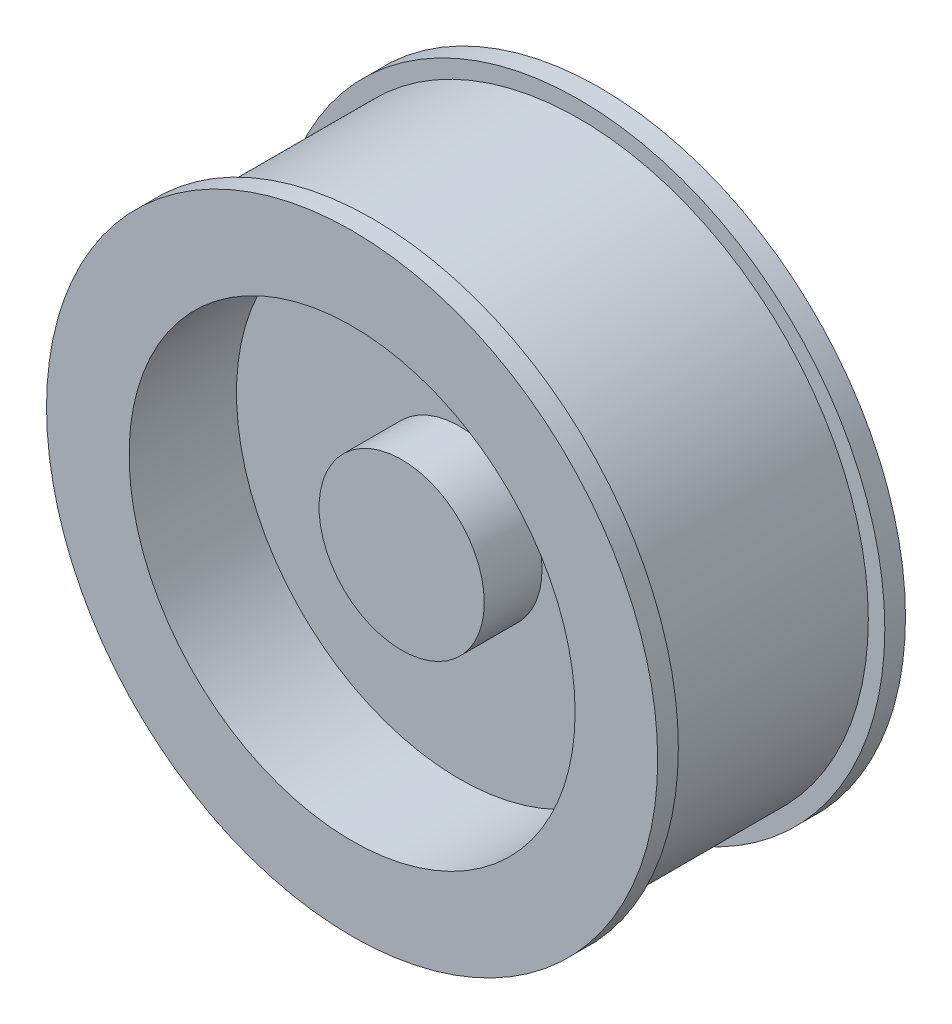
ISO-10303-21;
HEADER;
FILE_DESCRIPTION(('STEP AP214'),'2;1');
FILE_NAME('part.step','',(''),(''),'','','');
FILE_SCHEMA(('AUTOMOTIVE_DESIGN { 1 0 10303 214 1 1 1 1 }'));
ENDSEC;
DATA;
#1=APPLICATION_CONTEXT('core data for automotive mechanical design processes');
#2=APPLICATION_PROTOCOL_DEFINITION('international standard','automotive_design',2000,#1);
#3=PRODUCT_CONTEXT('',#1,'mechanical');
#4=PRODUCT('Part','Part','',(#3));
#5=PRODUCT_RELATED_PRODUCT_CATEGORY('part','',(#4));
#6=PRODUCT_DEFINITION_FORMATION('','',#4);
#7=PRODUCT_DEFINITION_CONTEXT('part definition',#1,'design');
#8=PRODUCT_DEFINITION('design','',#6,#7);
#9=PRODUCT_DEFINITION_SHAPE('','',#8);
#10=(LENGTH_UNIT() NAMED_UNIT(*) SI_UNIT(.MILLI.,.METRE.));
#11=(NAMED_UNIT(*) PLANE_ANGLE_UNIT() SI_UNIT($,.RADIAN.));
#12=(NAMED_UNIT(*) SI_UNIT($,.STERADIAN.) SOLID_ANGLE_UNIT());
#13=UNCERTAINTY_MEASURE_WITH_UNIT(LENGTH_MEASURE(1.E-05),#10,'distance_accuracy_value','');
#14=(GEOMETRIC_REPRESENTATION_CONTEXT(3) GLOBAL_UNCERTAINTY_ASSIGNED_CONTEXT((#13)) GLOBAL_UNIT_ASSIGNED_CONTEXT((#10,
#11,#12)) REPRESENTATION_CONTEXT('',''));
#15=CARTESIAN_POINT('',(0.,0.,0.));
#16=DIRECTION('',(0.,0.,1.));
#17=DIRECTION('',(1.,0.,0.));
#18=AXIS2_PLACEMENT_3D('',#15,#16,#17);
#19=CARTESIAN_POINT('',(0.,0.,30.));
#20=DIRECTION('',(0.,0.,-1.));
#21=DIRECTION('',(-1.,0.,0.));
#22=AXIS2_PLACEMENT_3D('',#19,#20,#21);
#23=PLANE('',#22);
#24=CARTESIAN_POINT('',(0.,-16.,30.));
#25=DIRECTION('',(0.,0.,1.));
#26=DIRECTION('',(1.,0.,0.));
#27=AXIS2_PLACEMENT_3D('',#24,#25,#26);
#28=CIRCLE('',#27,54.);
#29=CARTESIAN_POINT('',(54.,-16.,30.));
#30=VERTEX_POINT('',#29);
#31=EDGE_CURVE('E83',#30,#30,#28,.T.);
#32=ORIENTED_EDGE('',*,*,#31,.F.);
#33=EDGE_LOOP('',(#32));
#34=FACE_BOUND('',#33,.T.);
#35=CARTESIAN_POINT('',(0.,-16.,30.));
#36=DIRECTION('',(0.,0.,1.));
#37=DIRECTION('',(1.,0.,0.));
#38=AXIS2_PLACEMENT_3D('',#35,#36,#37);
#39=CIRCLE('',#38,74.);
#40=CARTESIAN_POINT('',(74.,-16.,30.));
#41=VERTEX_POINT('',#40);
#42=EDGE_CURVE('E10',#41,#41,#39,.T.);
#43=ORIENTED_EDGE('',*,*,#42,.T.);
#44=EDGE_LOOP('',(#43));
#45=FACE_BOUND('',#44,.T.);
#46=ADVANCED_FACE('F37',(#34,#45),#23,.F.);
#47=CARTESIAN_POINT('',(0.,-16.,-14.6133091179405));
#48=DIRECTION('',(0.,0.,1.));
#49=DIRECTION('',(1.,0.,0.));
#50=AXIS2_PLACEMENT_3D('',#47,#48,#49);
#51=CYLINDRICAL_SURFACE('',#50,74.);
#52=CARTESIAN_POINT('',(0.,-16.,25.));
#53=DIRECTION('',(0.,0.,1.));
#54=DIRECTION('',(1.,0.,0.));
#55=AXIS2_PLACEMENT_3D('',#52,#53,#54);
#56=CIRCLE('',#55,74.);
#57=CARTESIAN_POINT('',(74.,-16.,25.));
#58=VERTEX_POINT('',#57);
#59=EDGE_CURVE('E43',#58,#58,#56,.T.);
#60=ORIENTED_EDGE('',*,*,#59,.T.);
#61=EDGE_LOOP('',(#60));
#62=FACE_BOUND('',#61,.T.);
#63=ORIENTED_EDGE('',*,*,#42,.F.);
#64=EDGE_LOOP('',(#63));
#65=FACE_BOUND('',#64,.T.);
#66=ADVANCED_FACE('F91',(#62,#65),#51,.T.);
#67=CARTESIAN_POINT('',(0.,0.,25.));
#68=DIRECTION('',(0.,0.,-1.));
#69=DIRECTION('',(-1.,0.,0.));
#70=AXIS2_PLACEMENT_3D('',#67,#68,#69);
#71=PLANE('',#70);
#72=CARTESIAN_POINT('',(0.,-16.,25.));
#73=DIRECTION('',(0.,0.,1.));
#74=DIRECTION('',(1.,0.,0.));
#75=AXIS2_PLACEMENT_3D('',#72,#73,#74);
#76=CIRCLE('',#75,70.);
#77=CARTESIAN_POINT('',(70.,-16.,25.));
#78=VERTEX_POINT('',#77);
#79=EDGE_CURVE('E47',#78,#78,#76,.T.);
#80=ORIENTED_EDGE('',*,*,#79,.T.);
#81=EDGE_LOOP('',(#80));
#82=FACE_BOUND('',#81,.T.);
#83=ORIENTED_EDGE('',*,*,#59,.F.);
#84=EDGE_LOOP('',(#83));
#85=FACE_BOUND('',#84,.T.);
#86=ADVANCED_FACE('F95',(#82,#85),#71,.T.);
#87=CARTESIAN_POINT('',(0.,-16.,-14.6133091179405));
#88=DIRECTION('',(0.,0.,1.));
#89=DIRECTION('',(1.,0.,0.));
#90=AXIS2_PLACEMENT_3D('',#87,#88,#89);
#91=CYLINDRICAL_SURFACE('',#90,70.);
#92=CARTESIAN_POINT('',(0.,-16.,-25.));
#93=DIRECTION('',(0.,0.,1.));
#94=DIRECTION('',(1.,0.,0.));
#95=AXIS2_PLACEMENT_3D('',#92,#93,#94);
#96=CIRCLE('',#95,70.);
#97=CARTESIAN_POINT('',(70.,-16.,-25.));
#98=VERTEX_POINT('',#97);
#99=EDGE_CURVE('E51',#98,#98,#96,.T.);
#100=ORIENTED_EDGE('',*,*,#99,.T.);
#101=EDGE_LOOP('',(#100));
#102=FACE_BOUND('',#101,.T.);
#103=ORIENTED_EDGE('',*,*,#79,.F.);
#104=EDGE_LOOP('',(#103));
#105=FACE_BOUND('',#104,.T.);
#106=ADVANCED_FACE('F99',(#102,#105),#91,.T.);
#107=CARTESIAN_POINT('',(0.,0.,-25.));
#108=DIRECTION('',(0.,0.,-1.));
#109=DIRECTION('',(-1.,0.,0.));
#110=AXIS2_PLACEMENT_3D('',#107,#108,#109);
#111=PLANE('',#110);
#112=ORIENTED_EDGE('',*,*,#99,.F.);
#113=EDGE_LOOP('',(#112));
#114=FACE_BOUND('',#113,.T.);
#115=CARTESIAN_POINT('',(0.,-16.,-25.));
#116=DIRECTION('',(0.,0.,1.));
#117=DIRECTION('',(1.,0.,0.));
#118=AXIS2_PLACEMENT_3D('',#115,#116,#117);
#119=CIRCLE('',#118,74.);
#120=CARTESIAN_POINT('',(74.,-16.,-25.));
#121=VERTEX_POINT('',#120);
#122=EDGE_CURVE('E56',#121,#121,#119,.T.);
#123=ORIENTED_EDGE('',*,*,#122,.T.);
#124=EDGE_LOOP('',(#123));
#125=FACE_BOUND('',#124,.T.);
#126=ADVANCED_FACE('F106',(#114,#125),#111,.F.);
#127=CARTESIAN_POINT('',(0.,-16.,-14.6133091179405));
#128=DIRECTION('',(0.,0.,1.));
#129=DIRECTION('',(1.,0.,0.));
#130=AXIS2_PLACEMENT_3D('',#127,#128,#129);
#131=CYLINDRICAL_SURFACE('',#130,74.);
#132=CARTESIAN_POINT('',(0.,-16.,-30.));
#133=DIRECTION('',(0.,0.,1.));
#134=DIRECTION('',(1.,0.,0.));
#135=AXIS2_PLACEMENT_3D('',#132,#133,#134);
#136=CIRCLE('',#135,74.);
#137=CARTESIAN_POINT('',(74.,-16.,-30.));
#138=VERTEX_POINT('',#137);
#139=EDGE_CURVE('E59',#138,#138,#136,.T.);
#140=ORIENTED_EDGE('',*,*,#139,.T.);
#141=EDGE_LOOP('',(#140));
#142=FACE_BOUND('',#141,.T.);
#143=ORIENTED_EDGE('',*,*,#122,.F.);
#144=EDGE_LOOP('',(#143));
#145=FACE_BOUND('',#144,.T.);
#146=ADVANCED_FACE('F110',(#142,#145),#131,.T.);
#147=CARTESIAN_POINT('',(0.,0.,-30.));
#148=DIRECTION('',(0.,0.,1.));
#149=DIRECTION('',(1.,0.,0.));
#150=AXIS2_PLACEMENT_3D('',#147,#148,#149);
#151=PLANE('',#150);
#152=ORIENTED_EDGE('',*,*,#139,.F.);
#153=EDGE_LOOP('',(#152));
#154=FACE_BOUND('',#153,.T.);
#155=CARTESIAN_POINT('',(0.,-16.,-30.));
#156=DIRECTION('',(0.,0.,1.));
#157=DIRECTION('',(1.,0.,0.));
#158=AXIS2_PLACEMENT_3D('',#155,#156,#157);
#159=CIRCLE('',#158,54.);
#160=CARTESIAN_POINT('',(54.,-16.,-30.));
#161=VERTEX_POINT('',#160);
#162=EDGE_CURVE('E62',#161,#161,#159,.T.);
#163=ORIENTED_EDGE('',*,*,#162,.T.);
#164=EDGE_LOOP('',(#163));
#165=FACE_BOUND('',#164,.T.);
#166=ADVANCED_FACE('F114',(#154,#165),#151,.F.);
#167=CARTESIAN_POINT('',(0.,-16.,-14.6133091179405));
#168=DIRECTION('',(0.,0.,1.));
#169=DIRECTION('',(1.,0.,0.));
#170=AXIS2_PLACEMENT_3D('',#167,#168,#169);
#171=CYLINDRICAL_SURFACE('',#170,54.);
#172=CARTESIAN_POINT('',(0.,-16.,-4.));
#173=DIRECTION('',(0.,0.,1.));
#174=DIRECTION('',(1.,0.,0.));
#175=AXIS2_PLACEMENT_3D('',#172,#173,#174);
#176=CIRCLE('',#175,54.);
#177=CARTESIAN_POINT('',(54.,-16.,-4.));
#178=VERTEX_POINT('',#177);
#179=EDGE_CURVE('E65',#178,#178,#176,.T.);
#180=ORIENTED_EDGE('',*,*,#179,.T.);
#181=EDGE_LOOP('',(#180));
#182=FACE_BOUND('',#181,.T.);
#183=ORIENTED_EDGE('',*,*,#162,.F.);
#184=EDGE_LOOP('',(#183));
#185=FACE_BOUND('',#184,.T.);
#186=ADVANCED_FACE('F118',(#182,#185),#171,.F.);
#187=CARTESIAN_POINT('',(0.,0.,-4.));
#188=DIRECTION('',(0.,0.,-1.));
#189=DIRECTION('',(-1.,0.,0.));
#190=AXIS2_PLACEMENT_3D('',#187,#188,#189);
#191=PLANE('',#190);
#192=CARTESIAN_POINT('',(0.,-16.,-4.));
#193=DIRECTION('',(0.,0.,1.));
#194=DIRECTION('',(1.,0.,0.));
#195=AXIS2_PLACEMENT_3D('',#192,#193,#194);
#196=CIRCLE('',#195,20.);
#197=CARTESIAN_POINT('',(20.,-16.,-4.));
#198=VERTEX_POINT('',#197);
#199=EDGE_CURVE('E68',#198,#198,#196,.T.);
#200=ORIENTED_EDGE('',*,*,#199,.T.);
#201=EDGE_LOOP('',(#200));
#202=FACE_BOUND('',#201,.T.);
#203=ORIENTED_EDGE('',*,*,#179,.F.);
#204=EDGE_LOOP('',(#203));
#205=FACE_BOUND('',#204,.T.);
#206=ADVANCED_FACE('F122',(#202,#205),#191,.T.);
#207=CARTESIAN_POINT('',(0.,-16.,-14.6133091179405));
#208=DIRECTION('',(0.,0.,1.));
#209=DIRECTION('',(1.,0.,0.));
#210=AXIS2_PLACEMENT_3D('',#207,#208,#209);
#211=CYLINDRICAL_SURFACE('',#210,20.);
#212=ORIENTED_EDGE('',*,*,#199,.F.);
#213=EDGE_LOOP('',(#212));
#214=FACE_BOUND('',#213,.T.);
#215=CARTESIAN_POINT('',(0.,-16.,-18.));
#216=DIRECTION('',(0.,0.,1.));
#217=DIRECTION('',(1.,0.,0.));
#218=AXIS2_PLACEMENT_3D('',#215,#216,#217);
#219=CIRCLE('',#218,20.);
#220=CARTESIAN_POINT('',(20.,-16.,-18.));
#221=VERTEX_POINT('',#220);
#222=EDGE_CURVE('E71',#221,#221,#219,.T.);
#223=ORIENTED_EDGE('',*,*,#222,.T.);
#224=EDGE_LOOP('',(#223));
#225=FACE_BOUND('',#224,.T.);
#226=ADVANCED_FACE('F126',(#214,#225),#211,.T.);
#227=CARTESIAN_POINT('',(0.,0.,-18.));
#228=DIRECTION('',(0.,0.,-1.));
#229=DIRECTION('',(-1.,0.,0.));
#230=AXIS2_PLACEMENT_3D('',#227,#228,#229);
#231=PLANE('',#230);
#232=ORIENTED_EDGE('',*,*,#222,.F.);
#233=EDGE_LOOP('',(#232));
#234=FACE_BOUND('',#233,.T.);
#235=ADVANCED_FACE('F130',(#234),#231,.T.);
#236=CARTESIAN_POINT('',(0.,0.,18.));
#237=DIRECTION('',(0.,0.,-1.));
#238=DIRECTION('',(-1.,0.,0.));
#239=AXIS2_PLACEMENT_3D('',#236,#237,#238);
#240=PLANE('',#239);
#241=CARTESIAN_POINT('',(0.,-16.,18.));
#242=DIRECTION('',(0.,0.,1.));
#243=DIRECTION('',(1.,0.,0.));
#244=AXIS2_PLACEMENT_3D('',#241,#242,#243);
#245=CIRCLE('',#244,20.);
#246=CARTESIAN_POINT('',(20.,-16.,18.));
#247=VERTEX_POINT('',#246);
#248=EDGE_CURVE('E74',#247,#247,#245,.T.);
#249=ORIENTED_EDGE('',*,*,#248,.T.);
#250=EDGE_LOOP('',(#249));
#251=FACE_BOUND('',#250,.T.);
#252=ADVANCED_FACE('F134',(#251),#240,.F.);
#253=CARTESIAN_POINT('',(0.,-16.,-14.6133091179405));
#254=DIRECTION('',(0.,0.,1.));
#255=DIRECTION('',(1.,0.,0.));
#256=AXIS2_PLACEMENT_3D('',#253,#254,#255);
#257=CYLINDRICAL_SURFACE('',#256,20.);
#258=ORIENTED_EDGE('',*,*,#248,.F.);
#259=EDGE_LOOP('',(#258));
#260=FACE_BOUND('',#259,.T.);
#261=CARTESIAN_POINT('',(0.,-16.,4.));
#262=DIRECTION('',(0.,0.,1.));
#263=DIRECTION('',(1.,0.,0.));
#264=AXIS2_PLACEMENT_3D('',#261,#262,#263);
#265=CIRCLE('',#264,20.);
#266=CARTESIAN_POINT('',(20.,-16.,4.));
#267=VERTEX_POINT('',#266);
#268=EDGE_CURVE('E77',#267,#267,#265,.T.);
#269=ORIENTED_EDGE('',*,*,#268,.T.);
#270=EDGE_LOOP('',(#269));
#271=FACE_BOUND('',#270,.T.);
#272=ADVANCED_FACE('F138',(#260,#271),#257,.T.);
#273=CARTESIAN_POINT('',(0.,0.,4.));
#274=DIRECTION('',(0.,0.,-1.));
#275=DIRECTION('',(-1.,0.,0.));
#276=AXIS2_PLACEMENT_3D('',#273,#274,#275);
#277=PLANE('',#276);
#278=ORIENTED_EDGE('',*,*,#268,.F.);
#279=EDGE_LOOP('',(#278));
#280=FACE_BOUND('',#279,.T.);
#281=CARTESIAN_POINT('',(0.,-16.,4.));
#282=DIRECTION('',(0.,0.,1.));
#283=DIRECTION('',(1.,0.,0.));
#284=AXIS2_PLACEMENT_3D('',#281,#282,#283);
#285=CIRCLE('',#284,54.);
#286=CARTESIAN_POINT('',(54.,-16.,4.));
#287=VERTEX_POINT('',#286);
#288=EDGE_CURVE('E80',#287,#287,#285,.T.);
#289=ORIENTED_EDGE('',*,*,#288,.T.);
#290=EDGE_LOOP('',(#289));
#291=FACE_BOUND('',#290,.T.);
#292=ADVANCED_FACE('F142',(#280,#291),#277,.F.);
#293=CARTESIAN_POINT('',(0.,-16.,-14.6133091179405));
#294=DIRECTION('',(0.,0.,1.));
#295=DIRECTION('',(1.,0.,0.));
#296=AXIS2_PLACEMENT_3D('',#293,#294,#295);
#297=CYLINDRICAL_SURFACE('',#296,54.);
#298=ORIENTED_EDGE('',*,*,#31,.T.);
#299=EDGE_LOOP('',(#298));
#300=FACE_BOUND('',#299,.T.);
#301=ORIENTED_EDGE('',*,*,#288,.F.);
#302=EDGE_LOOP('',(#301));
#303=FACE_BOUND('',#302,.T.);
#304=ADVANCED_FACE('F87',(#300,#303),#297,.F.);
#305=CLOSED_SHELL('',(#46,#66,#86,#106,#126,#146,#166,#186,#206,#226,#235,#252,#272,#292,#304));
#306=MANIFOLD_SOLID_BREP('B2',#305);
#307=ADVANCED_BREP_SHAPE_REPRESENTATION('',(#18,#306),#14);
#308=SHAPE_DEFINITION_REPRESENTATION(#9,#307);
ENDSEC;
END-ISO-10303-21;
